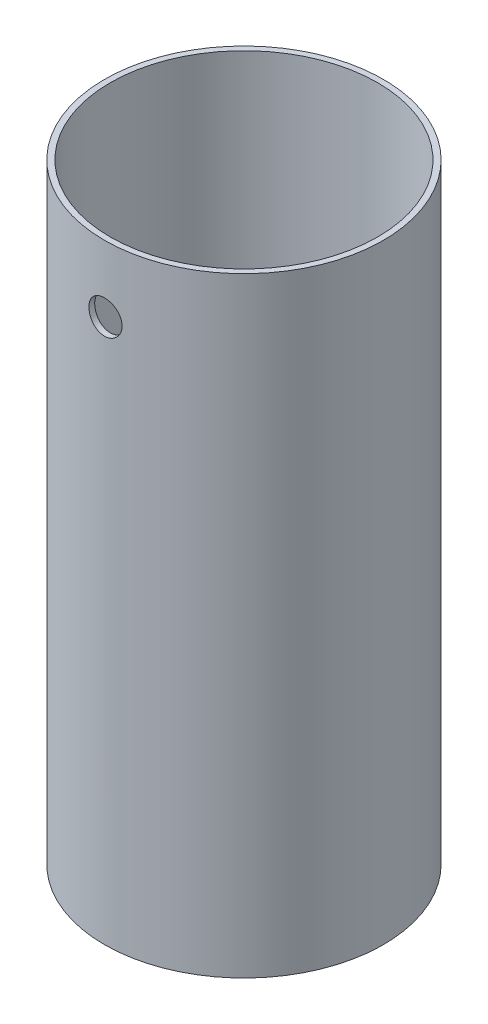
ISO-10303-21;
HEADER;
FILE_DESCRIPTION(('STEP AP214'),'2;1');
FILE_NAME('part.step','',(''),(''),'','','');
FILE_SCHEMA(('AUTOMOTIVE_DESIGN { 1 0 10303 214 1 1 1 1 }'));
ENDSEC;
DATA;
#1=APPLICATION_CONTEXT('core data for automotive mechanical design processes');
#2=APPLICATION_PROTOCOL_DEFINITION('international standard','automotive_design',2000,#1);
#3=PRODUCT_CONTEXT('',#1,'mechanical');
#4=PRODUCT('Part','Part','',(#3));
#5=PRODUCT_RELATED_PRODUCT_CATEGORY('part','',(#4));
#6=PRODUCT_DEFINITION_FORMATION('','',#4);
#7=PRODUCT_DEFINITION_CONTEXT('part definition',#1,'design');
#8=PRODUCT_DEFINITION('design','',#6,#7);
#9=PRODUCT_DEFINITION_SHAPE('','',#8);
#10=(LENGTH_UNIT() NAMED_UNIT(*) SI_UNIT(.MILLI.,.METRE.));
#11=(NAMED_UNIT(*) PLANE_ANGLE_UNIT() SI_UNIT($,.RADIAN.));
#12=(NAMED_UNIT(*) SI_UNIT($,.STERADIAN.) SOLID_ANGLE_UNIT());
#13=UNCERTAINTY_MEASURE_WITH_UNIT(LENGTH_MEASURE(1.E-05),#10,'distance_accuracy_value','');
#14=(GEOMETRIC_REPRESENTATION_CONTEXT(3) GLOBAL_UNCERTAINTY_ASSIGNED_CONTEXT((#13)) GLOBAL_UNIT_ASSIGNED_CONTEXT((#10,
#11,#12)) REPRESENTATION_CONTEXT('',''));
#15=CARTESIAN_POINT('',(0.,0.,0.));
#16=DIRECTION('',(0.,0.,1.));
#17=DIRECTION('',(1.,0.,0.));
#18=AXIS2_PLACEMENT_3D('',#15,#16,#17);
#19=CARTESIAN_POINT('',(0.,-350.,0.));
#20=DIRECTION('',(0.,1.,0.));
#21=DIRECTION('',(0.,0.,1.));
#22=AXIS2_PLACEMENT_3D('',#19,#20,#21);
#23=CYLINDRICAL_SURFACE('',#22,80.);
#24=CARTESIAN_POINT('',(0.,-350.,0.));
#25=DIRECTION('',(0.,1.,0.));
#26=DIRECTION('',(0.,0.,1.));
#27=AXIS2_PLACEMENT_3D('',#24,#25,#26);
#28=CIRCLE('',#27,80.);
#29=CARTESIAN_POINT('',(0.,-350.,80.));
#30=VERTEX_POINT('',#29);
#31=EDGE_CURVE('E10',#30,#30,#28,.T.);
#32=ORIENTED_EDGE('',*,*,#31,.T.);
#33=EDGE_LOOP('',(#32));
#34=FACE_BOUND('',#33,.T.);
#35=CARTESIAN_POINT('',(0.,0.,0.));
#36=DIRECTION('',(0.,1.,0.));
#37=DIRECTION('',(0.,0.,1.));
#38=AXIS2_PLACEMENT_3D('',#35,#36,#37);
#39=CIRCLE('',#38,80.);
#40=CARTESIAN_POINT('',(0.,0.,80.));
#41=VERTEX_POINT('',#40);
#42=EDGE_CURVE('E45',#41,#41,#39,.T.);
#43=ORIENTED_EDGE('',*,*,#42,.F.);
#44=EDGE_LOOP('',(#43));
#45=FACE_BOUND('',#44,.T.);
#46=CARTESIAN_POINT('',(0.,-47.625,80.));
#47=CARTESIAN_POINT('',(-0.266593744907239,-47.625002943416,80.0000009430643));
#48=CARTESIAN_POINT('',(-0.533143842801261,-47.6138034669084,79.9986647541579));
#49=CARTESIAN_POINT('',(-1.06442426623936,-47.5690908363575,79.9933593474143));
#50=CARTESIAN_POINT('',(-1.3291541589649,-47.5355725488036,79.9893895238202));
#51=CARTESIAN_POINT('',(-1.85506090860185,-47.4464208087788,79.9789222587866));
#52=CARTESIAN_POINT('',(-2.11623421202484,-47.3907667081138,79.9724224575158));
#53=CARTESIAN_POINT('',(-2.63292887303014,-47.2577549126416,79.9570790423409));
#54=CARTESIAN_POINT('',(-2.88845014593452,-47.1803968929066,79.9482353933473));
#55=CARTESIAN_POINT('',(-3.39185726278985,-47.0046034930332,79.9284600280595));
#56=CARTESIAN_POINT('',(-3.63974815201824,-46.9061823979782,79.9175297274827));
#57=CARTESIAN_POINT('',(-4.12633959336936,-46.6889428137285,79.893883760827));
#58=CARTESIAN_POINT('',(-4.36504002208516,-46.5701240507564,79.8811680707852));
#59=CARTESIAN_POINT('',(-4.83149976206289,-46.3129858513922,79.8543121958422));
#60=CARTESIAN_POINT('',(-5.05926291879749,-46.174673337183,79.8401725171025));
#61=CARTESIAN_POINT('',(-5.5024318435184,-45.8794461197774,79.8108550516599));
#62=CARTESIAN_POINT('',(-5.71783355237587,-45.7225253574719,79.7956769275087));
#63=CARTESIAN_POINT('',(-6.13560976285484,-45.3905019303961,79.7646435862942));
#64=CARTESIAN_POINT('',(-6.33792405456886,-45.2153237472738,79.7487857306607));
#65=CARTESIAN_POINT('',(-6.72709460510181,-44.8485785685412,79.7169011346681));
#66=CARTESIAN_POINT('',(-6.91395082597226,-44.6570115326998,79.7008743938946));
#67=CARTESIAN_POINT('',(-7.27093925824156,-44.2587815334923,79.6691004871426));
#68=CARTESIAN_POINT('',(-7.44106770305515,-44.0521151883991,79.6533533847813));
#69=CARTESIAN_POINT('',(-7.76330009714462,-43.6252407703973,79.622593323436));
#70=CARTESIAN_POINT('',(-7.91541032568283,-43.4050374559357,79.6075801097728));
#71=CARTESIAN_POINT('',(-8.20105839548249,-42.9518290243865,79.5786612436726));
#72=CARTESIAN_POINT('',(-8.33453471239583,-42.7187848847559,79.5647593221228));
#73=CARTESIAN_POINT('',(-8.58136976351104,-42.2421897049798,79.5385158665526));
#74=CARTESIAN_POINT('',(-8.69472844382235,-41.9986386366908,79.5261743367122));
#75=CARTESIAN_POINT('',(-8.90049914759014,-41.5027630100192,79.5034077113387));
#76=CARTESIAN_POINT('',(-8.99291173590688,-41.2504386884396,79.4929825641272));
#77=CARTESIAN_POINT('',(-9.15611258517726,-40.7388113659894,79.4743502945277));
#78=CARTESIAN_POINT('',(-9.22690095668532,-40.4795084008046,79.4661431608));
#79=CARTESIAN_POINT('',(-9.34604287628113,-39.9570301629249,79.4522187657537));
#80=CARTESIAN_POINT('',(-9.3945013999537,-39.6938791363496,79.4464898619016));
#81=CARTESIAN_POINT('',(-9.46911707053521,-39.1643906392439,79.4376311137379));
#82=CARTESIAN_POINT('',(-9.49527428077866,-38.898053177765,79.4345012620452));
#83=CARTESIAN_POINT('',(-9.52509122348903,-38.3641125739576,79.4309314056487));
#84=CARTESIAN_POINT('',(-9.52875168624543,-38.0965094729965,79.43049131363));
#85=CARTESIAN_POINT('',(-9.51354958294159,-37.5619534797753,79.4323135287108));
#86=CARTESIAN_POINT('',(-9.49468707942414,-37.2950005857117,79.4345758283062));
#87=CARTESIAN_POINT('',(-9.43473640733619,-36.7650395164448,79.4417185850588));
#88=CARTESIAN_POINT('',(-9.39376380828028,-36.5020180740345,79.4465854271807));
#89=CARTESIAN_POINT('',(-9.28997104188279,-35.980381618132,79.4587890950505));
#90=CARTESIAN_POINT('',(-9.22715096176167,-35.7217665870526,79.4661259109377));
#91=CARTESIAN_POINT('',(-9.08013579564818,-35.2108097937669,79.4830585853148));
#92=CARTESIAN_POINT('',(-8.99594434474891,-34.9584669727159,79.4926540596055));
#93=CARTESIAN_POINT('',(-8.80675663740657,-34.4616851123231,79.513835863743));
#94=CARTESIAN_POINT('',(-8.70175269585526,-34.2172490314801,79.5254229287832));
#95=CARTESIAN_POINT('',(-8.47144642458063,-33.7375261475222,79.5502861911314));
#96=CARTESIAN_POINT('',(-8.34609768271301,-33.5022618267305,79.5635662353716));
#97=CARTESIAN_POINT('',(-8.07616502137034,-33.0431129771183,79.5914188819344));
#98=CARTESIAN_POINT('',(-7.93158058853041,-32.819228752232,79.6059915187505));
#99=CARTESIAN_POINT('',(-7.62419475431423,-32.3843921399427,79.6360188105367));
#100=CARTESIAN_POINT('',(-7.4613929463508,-32.1734400413301,79.6514734851889));
#101=CARTESIAN_POINT('',(-7.11871212128366,-31.7659304390757,79.6828308444769));
#102=CARTESIAN_POINT('',(-6.93883303316329,-31.5693729953008,79.6987335309756));
#103=CARTESIAN_POINT('',(-6.56206453640662,-31.1908253839613,79.7306419494675));
#104=CARTESIAN_POINT('',(-6.36507530963451,-31.0089345518319,79.746647700836));
#105=CARTESIAN_POINT('',(-5.95645232889671,-30.6623884040279,79.7782091605956));
#106=CARTESIAN_POINT('',(-5.74481887573253,-30.4977327345068,79.7937648782214));
#107=CARTESIAN_POINT('',(-5.30834004746513,-30.1867853902402,79.8239900174612));
#108=CARTESIAN_POINT('',(-5.08349200279058,-30.0404974449368,79.8386592587696));
#109=CARTESIAN_POINT('',(-4.622286784975,-29.7674203769767,79.8666877341838));
#110=CARTESIAN_POINT('',(-4.38593393767686,-29.6406239988638,79.8800474550656));
#111=CARTESIAN_POINT('',(-3.90318944779239,-29.4073226687608,79.9050908823456));
#112=CARTESIAN_POINT('',(-3.65679301629765,-29.3008275373483,79.9167737769197));
#113=CARTESIAN_POINT('',(-3.15581545662005,-29.1089823064244,79.938124070456));
#114=CARTESIAN_POINT('',(-2.90123432093806,-29.0236322262875,79.9477914675713));
#115=CARTESIAN_POINT('',(-2.38571388970314,-28.8747099630607,79.9648352341899));
#116=CARTESIAN_POINT('',(-2.12477481501552,-28.8111370246175,79.9722116831553));
#117=CARTESIAN_POINT('',(-1.59840489906276,-28.706239154926,79.9844634911456));
#118=CARTESIAN_POINT('',(-1.33297408163944,-28.6649141056258,79.9893388634419));
#119=CARTESIAN_POINT('',(-0.801156382034865,-28.6050042830915,79.9964276590536));
#120=CARTESIAN_POINT('',(-0.534785084560434,-28.5862829903674,79.9986570617771));
#121=CARTESIAN_POINT('',(-0.00140262406414618,-28.571264364526,80.0004445067665));
#122=CARTESIAN_POINT('',(0.26560853637567,-28.5749669410734,80.000002559794));
#123=CARTESIAN_POINT('',(0.798355018283588,-28.6047680356844,79.9964598434602));
#124=CARTESIAN_POINT('',(1.06409036317024,-28.6308661410684,79.9933591230918));
#125=CARTESIAN_POINT('',(1.59239144079536,-28.7052635130773,79.984586558259));
#126=CARTESIAN_POINT('',(1.85495717504717,-28.7535627691015,79.9789147150223));
#127=CARTESIAN_POINT('',(2.37422647494779,-28.871817278927,79.9651817883914));
#128=CARTESIAN_POINT('',(2.63094594994038,-28.9417035821118,79.9571283155381));
#129=CARTESIAN_POINT('',(3.13766426231241,-29.1027012409544,79.9388476695779));
#130=CARTESIAN_POINT('',(3.38766060276317,-29.1938203641588,79.9286197011013));
#131=CARTESIAN_POINT('',(3.87904288256286,-29.3965935970278,79.906279555954));
#132=CARTESIAN_POINT('',(4.12043029508451,-29.5082441729931,79.8941677035767));
#133=CARTESIAN_POINT('',(4.59296862059754,-29.7512959945146,79.8683957439972));
#134=CARTESIAN_POINT('',(4.8241192500191,-29.882697786758,79.8547355939429));
#135=CARTESIAN_POINT('',(5.27563604485459,-30.164982115788,79.8261804360611));
#136=CARTESIAN_POINT('',(5.495946590261,-30.3159530655921,79.8112799409414));
#137=CARTESIAN_POINT('',(5.92308445651914,-30.6358263840396,79.7807177593005));
#138=CARTESIAN_POINT('',(6.12991174179954,-30.8047287999864,79.7650560707714));
#139=CARTESIAN_POINT('',(6.5286562230177,-31.1592901280879,79.7334099319643));
#140=CARTESIAN_POINT('',(6.72057277781325,-31.3449497600402,79.7174254678446));
#141=CARTESIAN_POINT('',(7.08814809373323,-31.7317226172976,79.6855833742086));
#142=CARTESIAN_POINT('',(7.26380717358597,-31.9328355394991,79.6697257422113));
#143=CARTESIAN_POINT('',(7.59854059374617,-32.350238645736,79.6384994684097));
#144=CARTESIAN_POINT('',(7.7575210604925,-32.5666043545743,79.6231339007764));
#145=CARTESIAN_POINT('',(8.05662884184643,-33.0119473978448,79.5934251088579));
#146=CARTESIAN_POINT('',(8.196763078246,-33.2409200582429,79.5790815101419));
#147=CARTESIAN_POINT('',(8.45726521831935,-33.7099804450902,79.5518185118885));
#148=CARTESIAN_POINT('',(8.57762969273604,-33.9500700906489,79.5388993595626));
#149=CARTESIAN_POINT('',(8.79768904886707,-34.4396291067122,79.5148597869256));
#150=CARTESIAN_POINT('',(8.89738400921912,-34.6890984415271,79.5037393597713));
#151=CARTESIAN_POINT('',(9.07515853703767,-35.1950314804959,79.4836428893765));
#152=CARTESIAN_POINT('',(9.15328960514092,-35.4514768844822,79.4746617440872));
#153=CARTESIAN_POINT('',(9.28767700769111,-35.970108066109,79.4590689438512));
#154=CARTESIAN_POINT('',(9.34393336457356,-36.2322938378616,79.4524572864744));
#155=CARTESIAN_POINT('',(9.43415044592583,-36.7605160514654,79.4417955013093));
#156=CARTESIAN_POINT('',(9.46811195419498,-37.0265523576108,79.4377452834711));
#157=CARTESIAN_POINT('',(9.51348751108035,-37.560567690295,79.4323238980522));
#158=CARTESIAN_POINT('',(9.52490166238266,-37.8285467079807,79.4309527182706));
#159=CARTESIAN_POINT('',(9.5250964583798,-38.3628262136256,79.4309293416387));
#160=CARTESIAN_POINT('',(9.51401897685634,-38.6291266601514,79.4322601013665));
#161=CARTESIAN_POINT('',(9.4695975632458,-39.15983622751,79.4375680695616));
#162=CARTESIAN_POINT('',(9.4362537308046,-39.4242453568015,79.4415452661856));
#163=CARTESIAN_POINT('',(9.3475468493376,-39.9492914344599,79.4520318105305));
#164=CARTESIAN_POINT('',(9.29218384799051,-40.2099283909935,79.4585411527684));
#165=CARTESIAN_POINT('',(9.15984605788046,-40.7255855571271,79.4739054789832));
#166=CARTESIAN_POINT('',(9.08287122973951,-40.9806057564922,79.4827604672339));
#167=CARTESIAN_POINT('',(8.90791286142914,-41.4831142085395,79.502558627937));
#168=CARTESIAN_POINT('',(8.80993929497601,-41.7306059734772,79.5135008087705));
#169=CARTESIAN_POINT('',(8.59363052867412,-42.2165391395423,79.5371695997451));
#170=CARTESIAN_POINT('',(8.47528825663754,-42.4549773619871,79.5498968293853));
#171=CARTESIAN_POINT('',(8.219131853552,-42.9210150740718,79.5767707584553));
#172=CARTESIAN_POINT('',(8.08132112476839,-43.1486164482635,79.5909172097399));
#173=CARTESIAN_POINT('',(7.78718333551223,-43.5914531053052,79.6202336755121));
#174=CARTESIAN_POINT('',(7.63085616325141,-43.806688313486,79.6354036961789));
#175=CARTESIAN_POINT('',(7.29975068579219,-44.224604170317,79.6664386662189));
#176=CARTESIAN_POINT('',(7.12486377035353,-44.4271985019249,79.6823073478396));
#177=CARTESIAN_POINT('',(6.7587337335393,-44.8168890612876,79.7141973828613));
#178=CARTESIAN_POINT('',(6.56749584048032,-45.0039902056858,79.7302186860154));
#179=CARTESIAN_POINT('',(6.16986954199303,-45.3615321328873,79.7619739853725));
#180=CARTESIAN_POINT('',(5.96347503964809,-45.5319661461571,79.777707862742));
#181=CARTESIAN_POINT('',(5.53704633679599,-45.8548869864031,79.8084381777929));
#182=CARTESIAN_POINT('',(5.31701231872541,-46.0073740533514,79.823434625333));
#183=CARTESIAN_POINT('',(4.86404800684376,-46.2938219116689,79.8523181087282));
#184=CARTESIAN_POINT('',(4.63107540973435,-46.4277162315646,79.8662010927144));
#185=CARTESIAN_POINT('',(4.15458851376839,-46.6753784384415,79.8924046517874));
#186=CARTESIAN_POINT('',(3.91107437177613,-46.7891466247832,79.9047252501128));
#187=CARTESIAN_POINT('',(3.41546180374509,-46.995629966249,79.9274425640266));
#188=CARTESIAN_POINT('',(3.163371932074,-47.0883654322951,79.937841133872));
#189=CARTESIAN_POINT('',(2.65227181252299,-47.2522185667984,79.9564310831803));
#190=CARTESIAN_POINT('',(2.39326323049045,-47.3233413888842,79.964622988779));
#191=CARTESIAN_POINT('',(1.78254547174809,-47.4635663539588,79.9808995572657));
#192=CARTESIAN_POINT('',(1.428795315578,-47.524042736375,79.9880326663389));
#193=CARTESIAN_POINT('',(0.716670473511341,-47.6047574513783,79.9975822387305));
#194=CARTESIAN_POINT('',(0.358295817528917,-47.6249960441172,79.9999987325434));
#195=CARTESIAN_POINT('',(0.,-47.625,80.));
#196=B_SPLINE_CURVE_WITH_KNOTS('',3,(#46,#47,#48,#49,#50,#51,#52,#53,#54,#55,#56,#57,#58,#59,
#60,#61,#62,#63,#64,#65,#66,#67,#68,#69,#70,#71,#72,#73,#74,#75,#76,#77,#78,#79,#80,#81,#82,#83,
#84,#85,#86,#87,#88,#89,#90,#91,#92,#93,#94,#95,#96,#97,#98,#99,#100,#101,#102,#103,#104,#105,
#106,#107,#108,#109,#110,#111,#112,#113,#114,#115,#116,#117,#118,#119,#120,#121,#122,#123,#124,
#125,#126,#127,#128,#129,#130,#131,#132,#133,#134,#135,#136,#137,#138,#139,#140,#141,#142,#143,
#144,#145,#146,#147,#148,#149,#150,#151,#152,#153,#154,#155,#156,#157,#158,#159,#160,#161,#162,
#163,#164,#165,#166,#167,#168,#169,#170,#171,#172,#173,#174,#175,#176,#177,#178,#179,#180,#181,
#182,#183,#184,#185,#186,#187,#188,#189,#190,#191,#192,#193,#194,#195),.UNSPECIFIED.,.T.,.F.,(4,
2,2,2,2,2,2,2,2,2,2,2,2,2,2,2,2,2,2,2,2,2,2,2,2,2,2,2,2,2,2,2,2,2,2,2,2,2,2,2,2,2,2,2,2,2,2,2,2,
2,2,2,2,2,2,2,2,2,2,2,2,2,2,2,2,2,2,2,2,2,2,2,2,2,4),(0.,0.799467743285717,1.59911943429049,
2.39951879300277,3.19993013507756,3.99980034478337,4.79968129117783,5.59927891412209,
6.39913761600629,7.20244700404481,8.00575836409369,8.80925019312246,9.61246118011068,
10.4182644267605,11.2240698319407,12.029853504111,12.8356330566199,13.6375848846206,
14.4395344351143,15.2414579525821,16.043379243237,16.8411489263361,17.6389154245805,
18.4365463201701,19.2344722951989,20.0342448291206,20.8340387117696,21.6338504482985,
22.4336655110275,23.238508155203,24.0433342723159,24.8483235405715,25.6530124337305,
26.4580896068417,27.2631675176173,28.0682175009519,28.8732632124814,29.6734219840739,
30.4735775322023,31.2737183362857,32.0738587583227,32.8714694480858,33.6693723850282,
34.467138122012,35.2649259441527,36.0664527092127,36.8679815887632,37.6695449139717,
38.4710925211753,39.2769335042939,40.0824777073217,40.8881614925806,41.6938422125375,
42.4975817536091,43.3013204703329,44.1050309292456,44.9087377278583,45.7073906181531,
46.5060399343576,47.3046875212344,48.1033365633026,48.9016071104155,49.7001553850464,
50.4985642793477,51.2969779940833,52.1003526301839,52.9034713366251,53.706914895199,
54.5103477095581,55.3165827599662,56.1228058172502,56.9282469726137,57.7334959160671,
58.8079689903069,59.8824351176656),.UNSPECIFIED.);
#197=CARTESIAN_POINT('',(0.,-47.625,80.));
#198=VERTEX_POINT('',#197);
#199=EDGE_CURVE('E55',#198,#198,#196,.T.);
#200=ORIENTED_EDGE('',*,*,#199,.T.);
#201=EDGE_LOOP('',(#200));
#202=FACE_BOUND('',#201,.T.);
#203=ADVANCED_FACE('F32',(#34,#45,#202),#23,.T.);
#204=CARTESIAN_POINT('',(0.,-350.,0.));
#205=DIRECTION('',(0.,1.,0.));
#206=DIRECTION('',(0.,0.,1.));
#207=AXIS2_PLACEMENT_3D('',#204,#205,#206);
#208=CYLINDRICAL_SURFACE('',#207,76.7);
#209=CARTESIAN_POINT('',(0.,-350.,0.));
#210=DIRECTION('',(0.,1.,0.));
#211=DIRECTION('',(0.,0.,1.));
#212=AXIS2_PLACEMENT_3D('',#209,#210,#211);
#213=CIRCLE('',#212,76.7);
#214=CARTESIAN_POINT('',(0.,-350.,76.7));
#215=VERTEX_POINT('',#214);
#216=EDGE_CURVE('E50',#215,#215,#213,.T.);
#217=ORIENTED_EDGE('',*,*,#216,.F.);
#218=EDGE_LOOP('',(#217));
#219=FACE_BOUND('',#218,.T.);
#220=CARTESIAN_POINT('',(0.,0.,0.));
#221=DIRECTION('',(0.,1.,0.));
#222=DIRECTION('',(0.,0.,1.));
#223=AXIS2_PLACEMENT_3D('',#220,#221,#222);
#224=CIRCLE('',#223,76.7);
#225=CARTESIAN_POINT('',(0.,0.,76.7));
#226=VERTEX_POINT('',#225);
#227=EDGE_CURVE('E52',#226,#226,#224,.T.);
#228=ORIENTED_EDGE('',*,*,#227,.T.);
#229=EDGE_LOOP('',(#228));
#230=FACE_BOUND('',#229,.T.);
#231=CARTESIAN_POINT('',(0.,-47.625,76.7));
#232=CARTESIAN_POINT('',(-0.266505115030481,-47.6250030416817,76.7000010135267));
#233=CARTESIAN_POINT('',(-0.532965510582258,-47.6138109613076,76.6986082472276));
#234=CARTESIAN_POINT('',(-1.06406590705412,-47.5691285013463,76.693078263586));
#235=CARTESIAN_POINT('',(-1.32870548069546,-47.5356330569619,76.6889404228743));
#236=CARTESIAN_POINT('',(-1.85442787112765,-47.4465436577864,76.6780301484872));
#237=CARTESIAN_POINT('',(-2.11550717870821,-47.3909293298688,76.6712552860429));
#238=CARTESIAN_POINT('',(-2.63201443056106,-47.25801477459,76.6552624418787));
#239=CARTESIAN_POINT('',(-2.88744228888597,-47.1807142176684,76.646044423031));
#240=CARTESIAN_POINT('',(-3.39066082216751,-47.0050557508002,76.6254317926869));
#241=CARTESIAN_POINT('',(-3.63845665828964,-46.9067124453445,76.6140386913709));
#242=CARTESIAN_POINT('',(-4.12486301930951,-46.6896483115327,76.5893909947296));
#243=CARTESIAN_POINT('',(-4.36347342278621,-46.5709272139182,76.5761363748079));
#244=CARTESIAN_POINT('',(-4.82976300228215,-46.3140032336771,76.5481412693467));
#245=CARTESIAN_POINT('',(-5.05744596046377,-46.1758071577964,76.5334013034647));
#246=CARTESIAN_POINT('',(-5.50046687451114,-45.8808310917509,76.502837792323));
#247=CARTESIAN_POINT('',(-5.71580077334691,-45.7240450455392,76.4870138946642));
#248=CARTESIAN_POINT('',(-6.13353659304807,-45.3922448930821,76.4546521255132));
#249=CARTESIAN_POINT('',(-6.33587308504621,-45.2171486995375,76.4381112519826));
#250=CARTESIAN_POINT('',(-6.72509643303225,-44.8505683168941,76.4048508864699));
#251=CARTESIAN_POINT('',(-6.91198324773196,-44.6590840840022,76.3881313940105));
#252=CARTESIAN_POINT('',(-7.2690432592874,-44.2610176141244,76.3549813393756));
#253=CARTESIAN_POINT('',(-7.43921267334889,-44.0544319783701,76.3385508432812));
#254=CARTESIAN_POINT('',(-7.76153810815222,-43.6277139746895,76.3064529258604));
#255=CARTESIAN_POINT('',(-7.91370040494531,-43.4075863674653,76.2907852397978));
#256=CARTESIAN_POINT('',(-8.19950376690756,-42.9544583179683,76.2605984040042));
#257=CARTESIAN_POINT('',(-8.33307801985796,-42.7214154456528,76.2460834740403));
#258=CARTESIAN_POINT('',(-8.58010774650953,-42.2448065018194,76.2186801509814));
#259=CARTESIAN_POINT('',(-8.69356316150225,-42.0012403995963,76.2057917626329));
#260=CARTESIAN_POINT('',(-8.89952342851856,-41.5053185877962,76.1820138669878));
#261=CARTESIAN_POINT('',(-8.99202889318145,-41.252963135495,76.1711243012415));
#262=CARTESIAN_POINT('',(-9.15540907652879,-40.7412577038872,76.1516595990577));
#263=CARTESIAN_POINT('',(-9.2262839157148,-40.4819077635546,76.1430844497269));
#264=CARTESIAN_POINT('',(-9.34556457414848,-39.9594299486895,76.1285361620047));
#265=CARTESIAN_POINT('',(-9.39408450394986,-39.696328490719,76.1225498189072));
#266=CARTESIAN_POINT('',(-9.46883025770613,-39.1669301701146,76.1132884278616));
#267=CARTESIAN_POINT('',(-9.49505615048755,-38.9006333173482,76.1100133715432));
#268=CARTESIAN_POINT('',(-9.52501631014297,-38.3667670725892,76.1062697376967));
#269=CARTESIAN_POINT('',(-9.52875136820569,-38.0991977256922,76.1058010614451));
#270=CARTESIAN_POINT('',(-9.51370377846914,-37.5647034150664,76.1076835645533));
#271=CARTESIAN_POINT('',(-9.49492119891263,-37.2977784493871,76.1100347353672));
#272=CARTESIAN_POINT('',(-9.43514927107609,-36.7679923540971,76.1174674844156));
#273=CARTESIAN_POINT('',(-9.39428579715177,-36.5051167937853,76.1225335845853));
#274=CARTESIAN_POINT('',(-9.2907374897766,-35.9837641341629,76.135240945219));
#275=CARTESIAN_POINT('',(-9.22805275123388,-35.725287015727,76.1428821944826));
#276=CARTESIAN_POINT('',(-9.08133457006498,-35.2145955026413,76.1605200536742));
#277=CARTESIAN_POINT('',(-8.99730473457801,-34.9623800577196,76.1705162656128));
#278=CARTESIAN_POINT('',(-8.80846657630748,-34.4658396715893,76.192584608675));
#279=CARTESIAN_POINT('',(-8.7036505749388,-34.2215176851941,76.2046575067247));
#280=CARTESIAN_POINT('',(-8.47372154374212,-33.7419546758008,76.2305677108755));
#281=CARTESIAN_POINT('',(-8.34855786246787,-33.5067381763226,76.2444094011424));
#282=CARTESIAN_POINT('',(-8.07901120962886,-33.0476683021994,76.2734419290978));
#283=CARTESIAN_POINT('',(-7.93462771592237,-32.8238152364913,76.2886328034355));
#284=CARTESIAN_POINT('',(-7.62765709576364,-32.3890199135553,76.3199360636667));
#285=CARTESIAN_POINT('',(-7.46506951066018,-32.17807798183,76.3360484727733));
#286=CARTESIAN_POINT('',(-7.12282756438292,-31.7705645861155,76.3687427386676));
#287=CARTESIAN_POINT('',(-6.94317312598974,-31.5739931871533,76.3853245975792));
#288=CARTESIAN_POINT('',(-6.56675696882665,-31.1952848614763,76.4186079118504));
#289=CARTESIAN_POINT('',(-6.36988659339145,-31.0132559194996,76.4353094091051));
#290=CARTESIAN_POINT('',(-5.9614871961702,-30.666423131495,76.4682458813767));
#291=CARTESIAN_POINT('',(-5.74995847441631,-30.5016189330781,76.4844808659327));
#292=CARTESIAN_POINT('',(-5.313671968487,-30.1903643843914,76.5160292036111));
#293=CARTESIAN_POINT('',(-5.0889115006287,-30.043917776415,76.5313423684859));
#294=CARTESIAN_POINT('',(-4.62786192734952,-29.7705149718979,76.5606048859861));
#295=CARTESIAN_POINT('',(-4.39157716010168,-29.6435515146727,76.5745547459599));
#296=CARTESIAN_POINT('',(-3.9089377097738,-29.4099050169206,76.6007090955029));
#297=CARTESIAN_POINT('',(-3.66257782882538,-29.3032326093283,76.6129126691563));
#298=CARTESIAN_POINT('',(-3.16165034599235,-29.1110312569598,76.635219162257));
#299=CARTESIAN_POINT('',(-2.907082735844,-29.025502333472,76.6453220795893));
#300=CARTESIAN_POINT('',(-2.39156763919391,-28.8762244091045,76.6631392141129));
#301=CARTESIAN_POINT('',(-2.13062039390257,-28.8124745861298,76.670853521466));
#302=CARTESIAN_POINT('',(-1.60421342290462,-28.7072278691081,76.6836736903545));
#303=CARTESIAN_POINT('',(-1.33875372329205,-28.6657308464257,76.6887795669683));
#304=CARTESIAN_POINT('',(-0.807000971211833,-28.6055016311804,76.6962123321449));
#305=CARTESIAN_POINT('',(-0.540724968147526,-28.586621070843,76.6985573307689));
#306=CARTESIAN_POINT('',(-0.00751834160420394,-28.5712695587821,76.7004629701226));
#307=CARTESIAN_POINT('',(0.259412279003521,-28.5747985089409,76.7000236230431));
#308=CARTESIAN_POINT('',(0.792011432845393,-28.6042391553049,76.6963730366559));
#309=CARTESIAN_POINT('',(1.05767999129282,-28.6301504024534,76.6931618529596));
#310=CARTESIAN_POINT('',(1.58586123698038,-28.7041614369091,76.6840583910338));
#311=CARTESIAN_POINT('',(1.84837392589703,-28.7522612124285,76.6781661142286));
#312=CARTESIAN_POINT('',(2.3674798145696,-28.8700888266259,76.6638913194569));
#313=CARTESIAN_POINT('',(2.62409025129661,-28.9397418001807,76.6555174255908));
#314=CARTESIAN_POINT('',(3.13060906375673,-29.1002489541464,76.6365027052921));
#315=CARTESIAN_POINT('',(3.38051495043357,-29.1911108901712,76.6258610497172));
#316=CARTESIAN_POINT('',(3.87173842409069,-29.3933470803117,76.6026115689435));
#317=CARTESIAN_POINT('',(4.1130574653641,-29.5047178410727,76.5900040786496));
#318=CARTESIAN_POINT('',(4.58548446038325,-29.7471888040358,76.5631720828975));
#319=CARTESIAN_POINT('',(4.81659212561186,-29.8782895632384,76.5489475317907));
#320=CARTESIAN_POINT('',(5.26814114476091,-30.1600070401235,76.5192012002839));
#321=CARTESIAN_POINT('',(5.48852234076546,-30.310719528208,76.5036731962467));
#322=CARTESIAN_POINT('',(5.91582449160981,-30.6300742890676,76.4718178908168));
#323=CARTESIAN_POINT('',(6.12274540801581,-30.798716613035,76.4554905871421));
#324=CARTESIAN_POINT('',(6.52170319076565,-31.1527599675746,76.4224931769513));
#325=CARTESIAN_POINT('',(6.71373937350651,-31.3381617670039,76.4058230547352));
#326=CARTESIAN_POINT('',(7.08158126526478,-31.7244249231584,76.3726084350579));
#327=CARTESIAN_POINT('',(7.25738728968776,-31.92528597932,76.3560639351612));
#328=CARTESIAN_POINT('',(7.5925221381444,-32.3422921212534,76.3234703549949));
#329=CARTESIAN_POINT('',(7.75174902898969,-32.5585194129729,76.3074247214749));
#330=CARTESIAN_POINT('',(8.05136027897031,-33.0036125576542,76.2763940018834));
#331=CARTESIAN_POINT('',(8.19175155584606,-33.2324737267537,76.2614085274094));
#332=CARTESIAN_POINT('',(8.45277597560183,-33.7013402586609,76.2329182640388));
#333=CARTESIAN_POINT('',(8.5734057049244,-33.9413475376476,76.2194137310889));
#334=CARTESIAN_POINT('',(8.79400047905962,-34.4307726446418,76.1942772630009));
#335=CARTESIAN_POINT('',(8.89396560910925,-34.6801904338279,76.1826453201387));
#336=CARTESIAN_POINT('',(9.07226447794296,-35.1860052635067,76.1616180325647));
#337=CARTESIAN_POINT('',(9.15065363176203,-35.4423825309911,76.1522169668755));
#338=CARTESIAN_POINT('',(9.28556231483533,-35.9609059318793,76.1358848059555));
#339=CARTESIAN_POINT('',(9.34208186807335,-36.2230520589562,76.1289537080159));
#340=CARTESIAN_POINT('',(9.43282661826513,-36.7512214601124,76.1177632087226));
#341=CARTESIAN_POINT('',(9.46705267407801,-37.0172445844263,76.1135037044458));
#342=CARTESIAN_POINT('',(9.51295571565151,-37.5512587021825,76.1077802263106));
#343=CARTESIAN_POINT('',(9.52463281367902,-37.8192496858204,76.1063162385339));
#344=CARTESIAN_POINT('',(9.52534767624895,-38.3534247015372,76.1062267510436));
#345=CARTESIAN_POINT('',(9.51453996960463,-38.6196085366515,76.1075818767196));
#346=CARTESIAN_POINT('',(9.4706777711827,-39.1501071493565,76.1130524253906));
#347=CARTESIAN_POINT('',(9.43762338781812,-39.4144219360493,76.1171678349341));
#348=CARTESIAN_POINT('',(9.34951384952276,-39.939301962038,76.1280405458344));
#349=CARTESIAN_POINT('',(9.29445875210371,-40.1998672111336,76.134797840285));
#350=CARTESIAN_POINT('',(9.16275421571807,-40.7154047280523,76.1507605343101));
#351=CARTESIAN_POINT('',(9.08610473433626,-40.9703769848886,76.1599659386931));
#352=CARTESIAN_POINT('',(8.91181827364202,-41.4728006850307,76.1805564688675));
#353=CARTESIAN_POINT('',(8.81419245490356,-41.7202560481382,76.1919404351923));
#354=CARTESIAN_POINT('',(8.59859655989869,-42.2061453609811,76.2165723806308));
#355=CARTESIAN_POINT('',(8.48061941953566,-42.444576143057,76.229821006687));
#356=CARTESIAN_POINT('',(8.22520774922625,-42.9106321347207,76.2578025534848));
#357=CARTESIAN_POINT('',(8.08777655543879,-43.138259188112,76.2725352196051));
#358=CARTESIAN_POINT('',(7.79440934198027,-43.5811833408359,76.3030728281171));
#359=CARTESIAN_POINT('',(7.63847320054732,-43.7964803590236,76.3188777775642));
#360=CARTESIAN_POINT('',(7.30807088396986,-44.2146721306196,76.3512267650101));
#361=CARTESIAN_POINT('',(7.13348672528311,-44.417473349339,76.3677750720847));
#362=CARTESIAN_POINT('',(6.76794694599045,-44.8076040742304,76.4010376545238));
#363=CARTESIAN_POINT('',(6.576996549409,-44.9949384801269,76.4177518754344));
#364=CARTESIAN_POINT('',(6.17992633779315,-45.3529736789562,76.4508875456814));
#365=CARTESIAN_POINT('',(5.97380043426092,-45.5236677311495,76.4673088741891));
#366=CARTESIAN_POINT('',(5.54788524529661,-45.8471351184521,76.4993893287283));
#367=CARTESIAN_POINT('',(5.32809613931329,-45.9999086888482,76.5150484647654));
#368=CARTESIAN_POINT('',(4.87552816406404,-46.2869975420796,76.545220879431));
#369=CARTESIAN_POINT('',(4.64270332337411,-46.4212408514257,76.5597296017967));
#370=CARTESIAN_POINT('',(4.16647426966779,-46.6696114104991,76.5871227659165));
#371=CARTESIAN_POINT('',(3.9230702162294,-46.7837389635235,76.6000072321597));
#372=CARTESIAN_POINT('',(3.42763622877064,-46.9909478002987,76.6237739353133));
#373=CARTESIAN_POINT('',(3.17561480973914,-47.0840492057845,76.6346580846256));
#374=CARTESIAN_POINT('',(2.66461224040597,-47.248635316776,76.6541273759786));
#375=CARTESIAN_POINT('',(2.40563274999999,-47.3201251288849,76.6627130610684));
#376=CARTESIAN_POINT('',(1.79297827670254,-47.4616549357197,76.6798432239078));
#377=CARTESIAN_POINT('',(1.43719385305845,-47.5228464357754,76.687370458856));
#378=CARTESIAN_POINT('',(0.720912334020578,-47.6045167637129,76.6974481435423));
#379=CARTESIAN_POINT('',(0.360415272782548,-47.624995886501,76.6999986293302));
#380=CARTESIAN_POINT('',(0.,-47.625,76.7));
#381=B_SPLINE_CURVE_WITH_KNOTS('',3,(#231,#232,#233,#234,#235,#236,#237,#238,#239,#240,#241,
#242,#243,#244,#245,#246,#247,#248,#249,#250,#251,#252,#253,#254,#255,#256,#257,#258,#259,#260,
#261,#262,#263,#264,#265,#266,#267,#268,#269,#270,#271,#272,#273,#274,#275,#276,#277,#278,#279,
#280,#281,#282,#283,#284,#285,#286,#287,#288,#289,#290,#291,#292,#293,#294,#295,#296,#297,#298,
#299,#300,#301,#302,#303,#304,#305,#306,#307,#308,#309,#310,#311,#312,#313,#314,#315,#316,#317,
#318,#319,#320,#321,#322,#323,#324,#325,#326,#327,#328,#329,#330,#331,#332,#333,#334,#335,#336,
#337,#338,#339,#340,#341,#342,#343,#344,#345,#346,#347,#348,#349,#350,#351,#352,#353,#354,#355,
#356,#357,#358,#359,#360,#361,#362,#363,#364,#365,#366,#367,#368,#369,#370,#371,#372,#373,#374,
#375,#376,#377,#378,#379,#380),.UNSPECIFIED.,.T.,.F.,(4,2,2,2,2,2,2,2,2,2,2,2,2,2,2,2,2,2,2,2,2,
2,2,2,2,2,2,2,2,2,2,2,2,2,2,2,2,2,2,2,2,2,2,2,2,2,2,2,2,2,2,2,2,2,2,2,2,2,2,2,2,2,2,2,2,2,2,2,2,
2,2,2,2,2,4),(0.,0.79919994935111,1.59858144829462,2.39870094819617,3.19883260798123,
3.99841073596452,4.79799942984199,5.5973093475197,6.39688037521044,7.20020360403819,
8.00352897962226,8.80703571407218,9.61026157098775,10.4163038000398,11.2223483811523,
12.0283693880628,12.8343859046474,13.6362412440738,14.4380941079892,15.2399187639403,
16.0417409898587,16.8390398399195,17.6363352222988,18.4334959580957,19.2309517221914,
20.030423874617,20.8299177506148,21.6294317743569,22.4289494156918,23.2339383833543,
24.0389108790843,24.84404720684,25.6488827561312,26.4541389011959,27.2593958570379,
28.0646224135127,28.8698443152118,29.6697543797697,30.4696609420072,31.2695514560621,
32.0694415451687,32.8665838229028,33.6640180545687,34.461316581329,35.2586376209602,
36.0600096027006,36.8613838725379,37.662794924871,38.4641903998617,39.2702534968289,
40.0760197364996,40.8819250156704,41.6878269705905,42.49163933748,43.2954508228486,
44.099231339471,44.9030078542151,45.7012785964639,46.4995454485888,47.2978102139901,
48.096076547337,48.8939192058431,49.6920393608395,50.4900228123358,51.2880115148257,
52.0913871587301,52.8945073172415,53.6979514666232,54.5013850660178,55.307856392921,
56.114315559142,56.9199996534661,57.7254932236325,58.806320337337,59.8871396218758),.UNSPECIFIED.);
#382=CARTESIAN_POINT('',(0.,-47.625,76.7));
#383=VERTEX_POINT('',#382);
#384=EDGE_CURVE('E36',#383,#383,#381,.T.);
#385=ORIENTED_EDGE('',*,*,#384,.F.);
#386=EDGE_LOOP('',(#385));
#387=FACE_BOUND('',#386,.T.);
#388=ADVANCED_FACE('F67',(#219,#230,#387),#208,.F.);
#389=CARTESIAN_POINT('',(0.,-350.,0.));
#390=DIRECTION('',(0.,1.,0.));
#391=DIRECTION('',(0.,0.,1.));
#392=AXIS2_PLACEMENT_3D('',#389,#390,#391);
#393=PLANE('',#392);
#394=ORIENTED_EDGE('',*,*,#216,.T.);
#395=EDGE_LOOP('',(#394));
#396=FACE_BOUND('',#395,.T.);
#397=ORIENTED_EDGE('',*,*,#31,.F.);
#398=EDGE_LOOP('',(#397));
#399=FACE_BOUND('',#398,.T.);
#400=ADVANCED_FACE('F72',(#396,#399),#393,.F.);
#401=CARTESIAN_POINT('',(0.,0.,0.));
#402=DIRECTION('',(0.,1.,0.));
#403=DIRECTION('',(0.,0.,1.));
#404=AXIS2_PLACEMENT_3D('',#401,#402,#403);
#405=PLANE('',#404);
#406=ORIENTED_EDGE('',*,*,#227,.F.);
#407=EDGE_LOOP('',(#406));
#408=FACE_BOUND('',#407,.T.);
#409=ORIENTED_EDGE('',*,*,#42,.T.);
#410=EDGE_LOOP('',(#409));
#411=FACE_BOUND('',#410,.T.);
#412=ADVANCED_FACE('F65',(#408,#411),#405,.T.);
#413=CARTESIAN_POINT('',(0.,-38.1,80.));
#414=DIRECTION('',(0.,0.,-1.));
#415=DIRECTION('',(-1.,0.,0.));
#416=AXIS2_PLACEMENT_3D('',#413,#414,#415);
#417=CYLINDRICAL_SURFACE('',#416,9.525);
#418=ORIENTED_EDGE('',*,*,#199,.F.);
#419=EDGE_LOOP('',(#418));
#420=FACE_BOUND('',#419,.T.);
#421=ORIENTED_EDGE('',*,*,#384,.T.);
#422=EDGE_LOOP('',(#421));
#423=FACE_BOUND('',#422,.T.);
#424=ADVANCED_FACE('F62',(#420,#423),#417,.F.);
#425=CLOSED_SHELL('',(#203,#388,#400,#412,#424));
#426=MANIFOLD_SOLID_BREP('B2',#425);
#427=ADVANCED_BREP_SHAPE_REPRESENTATION('',(#18,#426),#14);
#428=SHAPE_DEFINITION_REPRESENTATION(#9,#427);
ENDSEC;
END-ISO-10303-21;
